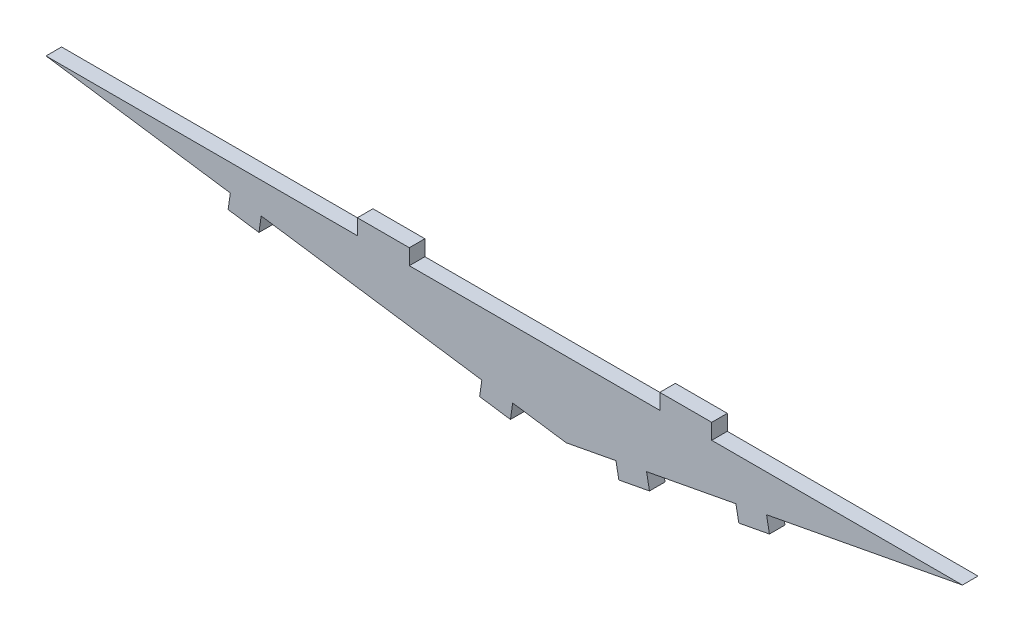
ISO-10303-21;
HEADER;
FILE_DESCRIPTION(('STEP AP214'),'2;1');
FILE_NAME('part.step','',(''),(''),'','','');
FILE_SCHEMA(('AUTOMOTIVE_DESIGN { 1 0 10303 214 1 1 1 1 }'));
ENDSEC;
DATA;
#1=APPLICATION_CONTEXT('core data for automotive mechanical design processes');
#2=APPLICATION_PROTOCOL_DEFINITION('international standard','automotive_design',2000,#1);
#3=PRODUCT_CONTEXT('',#1,'mechanical');
#4=PRODUCT('Part','Part','',(#3));
#5=PRODUCT_RELATED_PRODUCT_CATEGORY('part','',(#4));
#6=PRODUCT_DEFINITION_FORMATION('','',#4);
#7=PRODUCT_DEFINITION_CONTEXT('part definition',#1,'design');
#8=PRODUCT_DEFINITION('design','',#6,#7);
#9=PRODUCT_DEFINITION_SHAPE('','',#8);
#10=(LENGTH_UNIT() NAMED_UNIT(*) SI_UNIT(.MILLI.,.METRE.));
#11=(NAMED_UNIT(*) PLANE_ANGLE_UNIT() SI_UNIT($,.RADIAN.));
#12=(NAMED_UNIT(*) SI_UNIT($,.STERADIAN.) SOLID_ANGLE_UNIT());
#13=UNCERTAINTY_MEASURE_WITH_UNIT(LENGTH_MEASURE(1.E-05),#10,'distance_accuracy_value','');
#14=(GEOMETRIC_REPRESENTATION_CONTEXT(3) GLOBAL_UNCERTAINTY_ASSIGNED_CONTEXT((#13)) GLOBAL_UNIT_ASSIGNED_CONTEXT((#10,
#11,#12)) REPRESENTATION_CONTEXT('',''));
#15=CARTESIAN_POINT('',(0.,0.,0.));
#16=DIRECTION('',(0.,0.,1.));
#17=DIRECTION('',(1.,0.,0.));
#18=AXIS2_PLACEMENT_3D('',#15,#16,#17);
#19=CARTESIAN_POINT('',(-43.4902370561024,-7.93091694263517,-1.524));
#20=DIRECTION('',(0.185772423247235,-0.982592798040394,0.));
#21=DIRECTION('',(0.982592798040394,0.185772423247235,0.));
#22=AXIS2_PLACEMENT_3D('',#19,#20,#21);
#23=PLANE('',#22);
#24=DIRECTION('',(0.982592798040394,0.185772423247235,0.));
#25=VECTOR('',#24,1.);
#26=CARTESIAN_POINT('',(-43.4902370561024,-7.93091694263517,0.));
#27=LINE('',#26,#25);
#28=CARTESIAN_POINT('',(-48.3559852926874,-8.85085228372873,0.));
#29=VERTEX_POINT('',#28);
#30=CARTESIAN_POINT('',(-43.4902370561024,-7.93091694263517,0.));
#31=VERTEX_POINT('',#30);
#32=EDGE_CURVE('E247',#29,#31,#27,.T.);
#33=ORIENTED_EDGE('',*,*,#32,.F.);
#34=DIRECTION('',(0.,0.,1.));
#35=VECTOR('',#34,1.);
#36=CARTESIAN_POINT('',(-48.3559852926874,-8.85085228372873,-1.524));
#37=LINE('',#36,#35);
#38=CARTESIAN_POINT('',(-48.3559852926874,-8.85085228372873,-1.524));
#39=VERTEX_POINT('',#38);
#40=EDGE_CURVE('E11',#39,#29,#37,.T.);
#41=ORIENTED_EDGE('',*,*,#40,.F.);
#42=DIRECTION('',(0.982592798040394,0.185772423247235,0.));
#43=VECTOR('',#42,1.);
#44=CARTESIAN_POINT('',(-43.4902370561024,-7.93091694263517,-1.524));
#45=LINE('',#44,#43);
#46=CARTESIAN_POINT('',(-43.4902370561024,-7.93091694263517,-1.524));
#47=VERTEX_POINT('',#46);
#48=EDGE_CURVE('E324',#39,#47,#45,.T.);
#49=ORIENTED_EDGE('',*,*,#48,.T.);
#50=DIRECTION('',(0.,0.,1.));
#51=VECTOR('',#50,1.);
#52=CARTESIAN_POINT('',(-43.4902370561024,-7.93091694263517,-1.524));
#53=LINE('',#52,#51);
#54=EDGE_CURVE('E39',#47,#31,#53,.T.);
#55=ORIENTED_EDGE('',*,*,#54,.T.);
#56=EDGE_LOOP('',(#33,#41,#49,#55));
#57=FACE_BOUND('',#56,.T.);
#58=ADVANCED_FACE('F36',(#57),#23,.T.);
#59=CARTESIAN_POINT('',(-48.3559852926874,-8.85085228372873,-1.524));
#60=DIRECTION('',(-0.142523711830452,-0.989791387902557,0.));
#61=DIRECTION('',(0.989791387902557,-0.142523711830452,0.));
#62=AXIS2_PLACEMENT_3D('',#59,#60,#61);
#63=PLANE('',#62);
#64=DIRECTION('',(0.989791387902557,-0.142523711830452,0.));
#65=VECTOR('',#64,1.);
#66=CARTESIAN_POINT('',(-48.3559852926874,-8.85085228372873,0.));
#67=LINE('',#66,#65);
#68=CARTESIAN_POINT('',(-53.5933554469959,-8.09670404224538,0.));
#69=VERTEX_POINT('',#68);
#70=EDGE_CURVE('E322',#69,#29,#67,.T.);
#71=ORIENTED_EDGE('',*,*,#70,.F.);
#72=DIRECTION('',(0.,0.,1.));
#73=VECTOR('',#72,1.);
#74=CARTESIAN_POINT('',(-53.5933554469959,-8.09670404224538,-1.524));
#75=LINE('',#74,#73);
#76=CARTESIAN_POINT('',(-53.5933554469959,-8.09670404224538,-1.524));
#77=VERTEX_POINT('',#76);
#78=EDGE_CURVE('E45',#77,#69,#75,.T.);
#79=ORIENTED_EDGE('',*,*,#78,.F.);
#80=DIRECTION('',(0.989791387902557,-0.142523711830452,0.));
#81=VECTOR('',#80,1.);
#82=CARTESIAN_POINT('',(-48.3559852926874,-8.85085228372873,-1.524));
#83=LINE('',#82,#81);
#84=EDGE_CURVE('E237',#77,#39,#83,.T.);
#85=ORIENTED_EDGE('',*,*,#84,.T.);
#86=ORIENTED_EDGE('',*,*,#40,.T.);
#87=EDGE_LOOP('',(#71,#79,#85,#86));
#88=FACE_BOUND('',#87,.T.);
#89=ADVANCED_FACE('F374',(#88),#63,.T.);
#90=CARTESIAN_POINT('',(-53.5933554469959,-8.09670404224538,-1.524));
#91=DIRECTION('',(0.989791387902557,-0.142523711830451,0.));
#92=DIRECTION('',(0.142523711830451,0.989791387902557,0.));
#93=AXIS2_PLACEMENT_3D('',#90,#91,#92);
#94=PLANE('',#93);
#95=DIRECTION('',(0.142523711830451,0.989791387902557,0.));
#96=VECTOR('',#95,1.);
#97=CARTESIAN_POINT('',(-53.5933554469959,-8.09670404224538,0.));
#98=LINE('',#97,#96);
#99=CARTESIAN_POINT('',(-53.8105615838256,-9.60514611740887,0.));
#100=VERTEX_POINT('',#99);
#101=EDGE_CURVE('E224',#100,#69,#98,.T.);
#102=ORIENTED_EDGE('',*,*,#101,.F.);
#103=DIRECTION('',(0.,0.,1.));
#104=VECTOR('',#103,1.);
#105=CARTESIAN_POINT('',(-53.8105615838256,-9.60514611740887,-1.524));
#106=LINE('',#105,#104);
#107=CARTESIAN_POINT('',(-53.8105615838256,-9.60514611740887,-1.524));
#108=VERTEX_POINT('',#107);
#109=EDGE_CURVE('E219',#108,#100,#106,.T.);
#110=ORIENTED_EDGE('',*,*,#109,.F.);
#111=DIRECTION('',(0.142523711830451,0.989791387902557,0.));
#112=VECTOR('',#111,1.);
#113=CARTESIAN_POINT('',(-53.5933554469959,-8.09670404224538,-1.524));
#114=LINE('',#113,#112);
#115=EDGE_CURVE('E222',#108,#77,#114,.T.);
#116=ORIENTED_EDGE('',*,*,#115,.T.);
#117=ORIENTED_EDGE('',*,*,#78,.T.);
#118=EDGE_LOOP('',(#102,#110,#116,#117));
#119=FACE_BOUND('',#118,.T.);
#120=ADVANCED_FACE('F221',(#119),#94,.T.);
#121=CARTESIAN_POINT('',(-56.8274457341525,-9.17073384374966,-1.524));
#122=DIRECTION('',(-0.142523711830451,-0.989791387902557,0.));
#123=DIRECTION('',(0.989791387902557,-0.142523711830451,0.));
#124=AXIS2_PLACEMENT_3D('',#121,#122,#123);
#125=PLANE('',#124);
#126=DIRECTION('',(0.989791387902557,-0.142523711830451,0.));
#127=VECTOR('',#126,1.);
#128=CARTESIAN_POINT('',(-56.8274457341525,-9.17073384374966,0.));
#129=LINE('',#128,#127);
#130=CARTESIAN_POINT('',(-56.8274457341525,-9.17073384374966,0.));
#131=VERTEX_POINT('',#130);
#132=EDGE_CURVE('E319',#131,#100,#129,.T.);
#133=ORIENTED_EDGE('',*,*,#132,.F.);
#134=DIRECTION('',(0.,0.,1.));
#135=VECTOR('',#134,1.);
#136=CARTESIAN_POINT('',(-56.8274457341525,-9.17073384374966,-1.524));
#137=LINE('',#136,#135);
#138=CARTESIAN_POINT('',(-56.8274457341525,-9.17073384374966,-1.524));
#139=VERTEX_POINT('',#138);
#140=EDGE_CURVE('E229',#139,#131,#137,.T.);
#141=ORIENTED_EDGE('',*,*,#140,.F.);
#142=DIRECTION('',(0.989791387902557,-0.142523711830451,0.));
#143=VECTOR('',#142,1.);
#144=CARTESIAN_POINT('',(-56.8274457341525,-9.17073384374966,-1.524));
#145=LINE('',#144,#143);
#146=EDGE_CURVE('E235',#139,#108,#145,.T.);
#147=ORIENTED_EDGE('',*,*,#146,.T.);
#148=ORIENTED_EDGE('',*,*,#109,.T.);
#149=EDGE_LOOP('',(#133,#141,#147,#148));
#150=FACE_BOUND('',#149,.T.);
#151=ADVANCED_FACE('F239',(#150),#125,.T.);
#152=CARTESIAN_POINT('',(-56.6102395973229,-7.66229176858616,-1.524));
#153=DIRECTION('',(-0.989791387902557,0.142523711830451,0.));
#154=DIRECTION('',(-0.142523711830451,-0.989791387902557,0.));
#155=AXIS2_PLACEMENT_3D('',#152,#153,#154);
#156=PLANE('',#155);
#157=DIRECTION('',(-0.142523711830451,-0.989791387902557,0.));
#158=VECTOR('',#157,1.);
#159=CARTESIAN_POINT('',(-56.6102395973229,-7.66229176858616,0.));
#160=LINE('',#159,#158);
#161=CARTESIAN_POINT('',(-56.6102395973229,-7.66229176858616,0.));
#162=VERTEX_POINT('',#161);
#163=EDGE_CURVE('E316',#162,#131,#160,.T.);
#164=ORIENTED_EDGE('',*,*,#163,.F.);
#165=DIRECTION('',(0.,0.,1.));
#166=VECTOR('',#165,1.);
#167=CARTESIAN_POINT('',(-56.6102395973229,-7.66229176858616,-1.524));
#168=LINE('',#167,#166);
#169=CARTESIAN_POINT('',(-56.6102395973229,-7.66229176858616,-1.524));
#170=VERTEX_POINT('',#169);
#171=EDGE_CURVE('E328',#170,#162,#168,.T.);
#172=ORIENTED_EDGE('',*,*,#171,.F.);
#173=DIRECTION('',(-0.142523711830451,-0.989791387902557,0.));
#174=VECTOR('',#173,1.);
#175=CARTESIAN_POINT('',(-56.6102395973229,-7.66229176858616,-1.524));
#176=LINE('',#175,#174);
#177=EDGE_CURVE('E240',#170,#139,#176,.T.);
#178=ORIENTED_EDGE('',*,*,#177,.T.);
#179=ORIENTED_EDGE('',*,*,#140,.T.);
#180=EDGE_LOOP('',(#164,#172,#178,#179));
#181=FACE_BOUND('',#180,.T.);
#182=ADVANCED_FACE('F387',(#181),#156,.T.);
#183=CARTESIAN_POINT('',(-56.6102395973229,-7.66229176858616,-1.524));
#184=DIRECTION('',(-0.142523711830451,-0.989791387902557,0.));
#185=DIRECTION('',(0.989791387902557,-0.142523711830451,0.));
#186=AXIS2_PLACEMENT_3D('',#183,#184,#185);
#187=PLANE('',#186);
#188=DIRECTION('',(0.989791387902557,-0.142523711830451,0.));
#189=VECTOR('',#188,1.);
#190=CARTESIAN_POINT('',(-56.6102395973229,-7.66229176858616,0.));
#191=LINE('',#190,#189);
#192=CARTESIAN_POINT('',(-78.1919267212805,-4.55466505646862,0.));
#193=VERTEX_POINT('',#192);
#194=EDGE_CURVE('E313',#193,#162,#191,.T.);
#195=ORIENTED_EDGE('',*,*,#194,.F.);
#196=DIRECTION('',(0.,0.,1.));
#197=VECTOR('',#196,1.);
#198=CARTESIAN_POINT('',(-78.1919267212805,-4.55466505646862,-1.524));
#199=LINE('',#198,#197);
#200=CARTESIAN_POINT('',(-78.1919267212805,-4.55466505646862,-1.524));
#201=VERTEX_POINT('',#200);
#202=EDGE_CURVE('E330',#201,#193,#199,.T.);
#203=ORIENTED_EDGE('',*,*,#202,.F.);
#204=DIRECTION('',(0.989791387902557,-0.142523711830451,0.));
#205=VECTOR('',#204,1.);
#206=CARTESIAN_POINT('',(-56.6102395973229,-7.66229176858616,-1.524));
#207=LINE('',#206,#205);
#208=EDGE_CURVE('E242',#201,#170,#207,.T.);
#209=ORIENTED_EDGE('',*,*,#208,.T.);
#210=ORIENTED_EDGE('',*,*,#171,.T.);
#211=EDGE_LOOP('',(#195,#203,#209,#210));
#212=FACE_BOUND('',#211,.T.);
#213=ADVANCED_FACE('F390',(#212),#187,.T.);
#214=CARTESIAN_POINT('',(-78.1919267212805,-4.55466505646862,-1.524));
#215=DIRECTION('',(0.989791387902558,-0.142523711830447,0.));
#216=DIRECTION('',(0.142523711830447,0.989791387902558,0.));
#217=AXIS2_PLACEMENT_3D('',#214,#215,#216);
#218=PLANE('',#217);
#219=DIRECTION('',(0.142523711830447,0.989791387902558,0.));
#220=VECTOR('',#219,1.);
#221=CARTESIAN_POINT('',(-78.1919267212805,-4.55466505646862,0.));
#222=LINE('',#221,#220);
#223=CARTESIAN_POINT('',(-78.4091328581101,-6.06310713163212,0.));
#224=VERTEX_POINT('',#223);
#225=EDGE_CURVE('E310',#224,#193,#222,.T.);
#226=ORIENTED_EDGE('',*,*,#225,.F.);
#227=DIRECTION('',(0.,0.,1.));
#228=VECTOR('',#227,1.);
#229=CARTESIAN_POINT('',(-78.4091328581101,-6.06310713163212,-1.524));
#230=LINE('',#229,#228);
#231=CARTESIAN_POINT('',(-78.4091328581101,-6.06310713163212,-1.524));
#232=VERTEX_POINT('',#231);
#233=EDGE_CURVE('E332',#232,#224,#230,.T.);
#234=ORIENTED_EDGE('',*,*,#233,.F.);
#235=DIRECTION('',(0.142523711830447,0.989791387902558,0.));
#236=VECTOR('',#235,1.);
#237=CARTESIAN_POINT('',(-78.1919267212805,-4.55466505646862,-1.524));
#238=LINE('',#237,#236);
#239=EDGE_CURVE('E721',#232,#201,#238,.T.);
#240=ORIENTED_EDGE('',*,*,#239,.T.);
#241=ORIENTED_EDGE('',*,*,#202,.T.);
#242=EDGE_LOOP('',(#226,#234,#240,#241));
#243=FACE_BOUND('',#242,.T.);
#244=ADVANCED_FACE('F394',(#243),#218,.T.);
#245=CARTESIAN_POINT('',(-81.4260170084371,-5.6286948579729,-1.524));
#246=DIRECTION('',(-0.142523711830451,-0.989791387902557,0.));
#247=DIRECTION('',(0.989791387902557,-0.142523711830451,0.));
#248=AXIS2_PLACEMENT_3D('',#245,#246,#247);
#249=PLANE('',#248);
#250=DIRECTION('',(0.989791387902557,-0.142523711830451,0.));
#251=VECTOR('',#250,1.);
#252=CARTESIAN_POINT('',(-81.4260170084371,-5.6286948579729,0.));
#253=LINE('',#252,#251);
#254=CARTESIAN_POINT('',(-81.4260170084371,-5.6286948579729,0.));
#255=VERTEX_POINT('',#254);
#256=EDGE_CURVE('E307',#255,#224,#253,.T.);
#257=ORIENTED_EDGE('',*,*,#256,.F.);
#258=DIRECTION('',(0.,0.,1.));
#259=VECTOR('',#258,1.);
#260=CARTESIAN_POINT('',(-81.4260170084371,-5.6286948579729,-1.524));
#261=LINE('',#260,#259);
#262=CARTESIAN_POINT('',(-81.4260170084371,-5.6286948579729,-1.524));
#263=VERTEX_POINT('',#262);
#264=EDGE_CURVE('E334',#263,#255,#261,.T.);
#265=ORIENTED_EDGE('',*,*,#264,.F.);
#266=DIRECTION('',(0.989791387902557,-0.142523711830451,0.));
#267=VECTOR('',#266,1.);
#268=CARTESIAN_POINT('',(-81.4260170084371,-5.6286948579729,-1.524));
#269=LINE('',#268,#267);
#270=EDGE_CURVE('E725',#263,#232,#269,.T.);
#271=ORIENTED_EDGE('',*,*,#270,.T.);
#272=ORIENTED_EDGE('',*,*,#233,.T.);
#273=EDGE_LOOP('',(#257,#265,#271,#272));
#274=FACE_BOUND('',#273,.T.);
#275=ADVANCED_FACE('F398',(#274),#249,.T.);
#276=CARTESIAN_POINT('',(-81.2088108716075,-4.1202527828094,-1.524));
#277=DIRECTION('',(-0.989791387902558,0.142523711830447,0.));
#278=DIRECTION('',(-0.142523711830447,-0.989791387902558,0.));
#279=AXIS2_PLACEMENT_3D('',#276,#277,#278);
#280=PLANE('',#279);
#281=DIRECTION('',(-0.142523711830447,-0.989791387902558,0.));
#282=VECTOR('',#281,1.);
#283=CARTESIAN_POINT('',(-81.2088108716075,-4.1202527828094,0.));
#284=LINE('',#283,#282);
#285=CARTESIAN_POINT('',(-81.2088108716075,-4.1202527828094,0.));
#286=VERTEX_POINT('',#285);
#287=EDGE_CURVE('E304',#286,#255,#284,.T.);
#288=ORIENTED_EDGE('',*,*,#287,.F.);
#289=DIRECTION('',(0.,0.,1.));
#290=VECTOR('',#289,1.);
#291=CARTESIAN_POINT('',(-81.2088108716075,-4.1202527828094,-1.524));
#292=LINE('',#291,#290);
#293=CARTESIAN_POINT('',(-81.2088108716075,-4.1202527828094,-1.524));
#294=VERTEX_POINT('',#293);
#295=EDGE_CURVE('E336',#294,#286,#292,.T.);
#296=ORIENTED_EDGE('',*,*,#295,.F.);
#297=DIRECTION('',(-0.142523711830447,-0.989791387902558,0.));
#298=VECTOR('',#297,1.);
#299=CARTESIAN_POINT('',(-81.2088108716075,-4.1202527828094,-1.524));
#300=LINE('',#299,#298);
#301=EDGE_CURVE('E714',#294,#263,#300,.T.);
#302=ORIENTED_EDGE('',*,*,#301,.T.);
#303=ORIENTED_EDGE('',*,*,#264,.T.);
#304=EDGE_LOOP('',(#288,#296,#302,#303));
#305=FACE_BOUND('',#304,.T.);
#306=ADVANCED_FACE('F402',(#305),#280,.T.);
#307=CARTESIAN_POINT('',(-81.2088108716075,-4.1202527828094,-1.524));
#308=DIRECTION('',(-0.142523711830451,-0.989791387902557,0.));
#309=DIRECTION('',(0.989791387902557,-0.142523711830451,0.));
#310=AXIS2_PLACEMENT_3D('',#307,#308,#309);
#311=PLANE('',#310);
#312=DIRECTION('',(0.989791387902557,-0.142523711830451,0.));
#313=VECTOR('',#312,1.);
#314=CARTESIAN_POINT('',(-81.2088108716075,-4.1202527828094,0.));
#315=LINE('',#314,#313);
#316=CARTESIAN_POINT('',(-99.2391344734781,-1.524,0.));
#317=VERTEX_POINT('',#316);
#318=EDGE_CURVE('E301',#317,#286,#315,.T.);
#319=ORIENTED_EDGE('',*,*,#318,.F.);
#320=DIRECTION('',(0.,0.,1.));
#321=VECTOR('',#320,1.);
#322=CARTESIAN_POINT('',(-99.2391344734781,-1.524,-1.524));
#323=LINE('',#322,#321);
#324=CARTESIAN_POINT('',(-99.2391344734781,-1.524,-1.524));
#325=VERTEX_POINT('',#324);
#326=EDGE_CURVE('E338',#325,#317,#323,.T.);
#327=ORIENTED_EDGE('',*,*,#326,.F.);
#328=DIRECTION('',(0.989791387902557,-0.142523711830451,0.));
#329=VECTOR('',#328,1.);
#330=CARTESIAN_POINT('',(-81.2088108716075,-4.1202527828094,-1.524));
#331=LINE('',#330,#329);
#332=EDGE_CURVE('E710',#325,#294,#331,.T.);
#333=ORIENTED_EDGE('',*,*,#332,.T.);
#334=ORIENTED_EDGE('',*,*,#295,.T.);
#335=EDGE_LOOP('',(#319,#327,#333,#334));
#336=FACE_BOUND('',#335,.T.);
#337=ADVANCED_FACE('F406',(#336),#311,.T.);
#338=CARTESIAN_POINT('',(-68.7830945293226,-1.524,-1.524));
#339=DIRECTION('',(0.,1.,0.));
#340=DIRECTION('',(0.,0.,1.));
#341=AXIS2_PLACEMENT_3D('',#338,#339,#340);
#342=PLANE('',#341);
#343=DIRECTION('',(-1.,0.,0.));
#344=VECTOR('',#343,1.);
#345=CARTESIAN_POINT('',(-68.7830945293226,-1.524,0.));
#346=LINE('',#345,#344);
#347=CARTESIAN_POINT('',(-68.7830945293226,-1.524,0.));
#348=VERTEX_POINT('',#347);
#349=EDGE_CURVE('E298',#348,#317,#346,.T.);
#350=ORIENTED_EDGE('',*,*,#349,.F.);
#351=DIRECTION('',(0.,0.,1.));
#352=VECTOR('',#351,1.);
#353=CARTESIAN_POINT('',(-68.7830945293226,-1.524,-1.524));
#354=LINE('',#353,#352);
#355=CARTESIAN_POINT('',(-68.7830945293226,-1.524,-1.524));
#356=VERTEX_POINT('',#355);
#357=EDGE_CURVE('E340',#356,#348,#354,.T.);
#358=ORIENTED_EDGE('',*,*,#357,.F.);
#359=DIRECTION('',(-1.,0.,0.));
#360=VECTOR('',#359,1.);
#361=CARTESIAN_POINT('',(-68.7830945293226,-1.524,-1.524));
#362=LINE('',#361,#360);
#363=EDGE_CURVE('E731',#356,#325,#362,.T.);
#364=ORIENTED_EDGE('',*,*,#363,.T.);
#365=ORIENTED_EDGE('',*,*,#326,.T.);
#366=EDGE_LOOP('',(#350,#358,#364,#365));
#367=FACE_BOUND('',#366,.T.);
#368=ADVANCED_FACE('F410',(#367),#342,.T.);
#369=CARTESIAN_POINT('',(-68.7830945293226,-1.524,-1.524));
#370=DIRECTION('',(-1.,0.,0.));
#371=DIRECTION('',(0.,0.,1.));
#372=AXIS2_PLACEMENT_3D('',#369,#370,#371);
#373=PLANE('',#372);
#374=DIRECTION('',(0.,-1.,0.));
#375=VECTOR('',#374,1.);
#376=CARTESIAN_POINT('',(-68.7830945293226,-1.524,0.));
#377=LINE('',#376,#375);
#378=CARTESIAN_POINT('',(-68.7830945293226,0.,0.));
#379=VERTEX_POINT('',#378);
#380=EDGE_CURVE('E295',#379,#348,#377,.T.);
#381=ORIENTED_EDGE('',*,*,#380,.F.);
#382=DIRECTION('',(0.,0.,1.));
#383=VECTOR('',#382,1.);
#384=CARTESIAN_POINT('',(-68.7830945293226,0.,-1.524));
#385=LINE('',#384,#383);
#386=CARTESIAN_POINT('',(-68.7830945293226,0.,-1.524));
#387=VERTEX_POINT('',#386);
#388=EDGE_CURVE('E342',#387,#379,#385,.T.);
#389=ORIENTED_EDGE('',*,*,#388,.F.);
#390=DIRECTION('',(0.,-1.,0.));
#391=VECTOR('',#390,1.);
#392=CARTESIAN_POINT('',(-68.7830945293226,-1.524,-1.524));
#393=LINE('',#392,#391);
#394=EDGE_CURVE('E703',#387,#356,#393,.T.);
#395=ORIENTED_EDGE('',*,*,#394,.T.);
#396=ORIENTED_EDGE('',*,*,#357,.T.);
#397=EDGE_LOOP('',(#381,#389,#395,#396));
#398=FACE_BOUND('',#397,.T.);
#399=ADVANCED_FACE('F414',(#398),#373,.T.);
#400=CARTESIAN_POINT('',(-63.7030945293226,0.,-1.524));
#401=DIRECTION('',(0.,1.,0.));
#402=DIRECTION('',(0.,0.,1.));
#403=AXIS2_PLACEMENT_3D('',#400,#401,#402);
#404=PLANE('',#403);
#405=DIRECTION('',(-1.,0.,0.));
#406=VECTOR('',#405,1.);
#407=CARTESIAN_POINT('',(-63.7030945293226,0.,0.));
#408=LINE('',#407,#406);
#409=CARTESIAN_POINT('',(-63.7030945293226,0.,0.));
#410=VERTEX_POINT('',#409);
#411=EDGE_CURVE('E292',#410,#379,#408,.T.);
#412=ORIENTED_EDGE('',*,*,#411,.F.);
#413=DIRECTION('',(0.,0.,1.));
#414=VECTOR('',#413,1.);
#415=CARTESIAN_POINT('',(-63.7030945293226,0.,-1.524));
#416=LINE('',#415,#414);
#417=CARTESIAN_POINT('',(-63.7030945293226,0.,-1.524));
#418=VERTEX_POINT('',#417);
#419=EDGE_CURVE('E344',#418,#410,#416,.T.);
#420=ORIENTED_EDGE('',*,*,#419,.F.);
#421=DIRECTION('',(-1.,0.,0.));
#422=VECTOR('',#421,1.);
#423=CARTESIAN_POINT('',(-63.7030945293226,0.,-1.524));
#424=LINE('',#423,#422);
#425=EDGE_CURVE('E699',#418,#387,#424,.T.);
#426=ORIENTED_EDGE('',*,*,#425,.T.);
#427=ORIENTED_EDGE('',*,*,#388,.T.);
#428=EDGE_LOOP('',(#412,#420,#426,#427));
#429=FACE_BOUND('',#428,.T.);
#430=ADVANCED_FACE('F418',(#429),#404,.T.);
#431=CARTESIAN_POINT('',(-63.7030945293226,-1.524,-1.524));
#432=DIRECTION('',(1.,0.,0.));
#433=DIRECTION('',(0.,0.,-1.));
#434=AXIS2_PLACEMENT_3D('',#431,#432,#433);
#435=PLANE('',#434);
#436=DIRECTION('',(0.,1.,0.));
#437=VECTOR('',#436,1.);
#438=CARTESIAN_POINT('',(-63.7030945293226,-1.524,0.));
#439=LINE('',#438,#437);
#440=CARTESIAN_POINT('',(-63.7030945293226,-1.524,0.));
#441=VERTEX_POINT('',#440);
#442=EDGE_CURVE('E289',#441,#410,#439,.T.);
#443=ORIENTED_EDGE('',*,*,#442,.F.);
#444=DIRECTION('',(0.,0.,1.));
#445=VECTOR('',#444,1.);
#446=CARTESIAN_POINT('',(-63.7030945293226,-1.524,-1.524));
#447=LINE('',#446,#445);
#448=CARTESIAN_POINT('',(-63.7030945293226,-1.524,-1.524));
#449=VERTEX_POINT('',#448);
#450=EDGE_CURVE('E346',#449,#441,#447,.T.);
#451=ORIENTED_EDGE('',*,*,#450,.F.);
#452=DIRECTION('',(0.,1.,0.));
#453=VECTOR('',#452,1.);
#454=CARTESIAN_POINT('',(-63.7030945293226,-1.524,-1.524));
#455=LINE('',#454,#453);
#456=EDGE_CURVE('E735',#449,#418,#455,.T.);
#457=ORIENTED_EDGE('',*,*,#456,.T.);
#458=ORIENTED_EDGE('',*,*,#419,.T.);
#459=EDGE_LOOP('',(#443,#451,#457,#458));
#460=FACE_BOUND('',#459,.T.);
#461=ADVANCED_FACE('F422',(#460),#435,.T.);
#462=CARTESIAN_POINT('',(-39.202780193833,-1.524,-1.524));
#463=DIRECTION('',(0.,1.,0.));
#464=DIRECTION('',(-1.,0.,0.));
#465=AXIS2_PLACEMENT_3D('',#462,#463,#464);
#466=PLANE('',#465);
#467=DIRECTION('',(-1.,0.,0.));
#468=VECTOR('',#467,1.);
#469=CARTESIAN_POINT('',(-39.202780193833,-1.524,0.));
#470=LINE('',#469,#468);
#471=CARTESIAN_POINT('',(-39.202780193833,-1.524,0.));
#472=VERTEX_POINT('',#471);
#473=EDGE_CURVE('E286',#472,#441,#470,.T.);
#474=ORIENTED_EDGE('',*,*,#473,.F.);
#475=DIRECTION('',(0.,0.,1.));
#476=VECTOR('',#475,1.);
#477=CARTESIAN_POINT('',(-39.202780193833,-1.524,-1.524));
#478=LINE('',#477,#476);
#479=CARTESIAN_POINT('',(-39.202780193833,-1.524,-1.524));
#480=VERTEX_POINT('',#479);
#481=EDGE_CURVE('E348',#480,#472,#478,.T.);
#482=ORIENTED_EDGE('',*,*,#481,.F.);
#483=DIRECTION('',(-1.,0.,0.));
#484=VECTOR('',#483,1.);
#485=CARTESIAN_POINT('',(-39.202780193833,-1.524,-1.524));
#486=LINE('',#485,#484);
#487=EDGE_CURVE('E692',#480,#449,#486,.T.);
#488=ORIENTED_EDGE('',*,*,#487,.T.);
#489=ORIENTED_EDGE('',*,*,#450,.T.);
#490=EDGE_LOOP('',(#474,#482,#488,#489));
#491=FACE_BOUND('',#490,.T.);
#492=ADVANCED_FACE('F426',(#491),#466,.T.);
#493=CARTESIAN_POINT('',(-39.202780193833,-1.524,-1.524));
#494=DIRECTION('',(-1.,0.,0.));
#495=DIRECTION('',(0.,0.,1.));
#496=AXIS2_PLACEMENT_3D('',#493,#494,#495);
#497=PLANE('',#496);
#498=DIRECTION('',(0.,-1.,0.));
#499=VECTOR('',#498,1.);
#500=CARTESIAN_POINT('',(-39.202780193833,-1.524,0.));
#501=LINE('',#500,#499);
#502=CARTESIAN_POINT('',(-39.202780193833,0.,0.));
#503=VERTEX_POINT('',#502);
#504=EDGE_CURVE('E283',#503,#472,#501,.T.);
#505=ORIENTED_EDGE('',*,*,#504,.F.);
#506=DIRECTION('',(0.,0.,1.));
#507=VECTOR('',#506,1.);
#508=CARTESIAN_POINT('',(-39.202780193833,0.,-1.524));
#509=LINE('',#508,#507);
#510=CARTESIAN_POINT('',(-39.202780193833,0.,-1.524));
#511=VERTEX_POINT('',#510);
#512=EDGE_CURVE('E350',#511,#503,#509,.T.);
#513=ORIENTED_EDGE('',*,*,#512,.F.);
#514=DIRECTION('',(0.,-1.,0.));
#515=VECTOR('',#514,1.);
#516=CARTESIAN_POINT('',(-39.202780193833,-1.524,-1.524));
#517=LINE('',#516,#515);
#518=EDGE_CURVE('E688',#511,#480,#517,.T.);
#519=ORIENTED_EDGE('',*,*,#518,.T.);
#520=ORIENTED_EDGE('',*,*,#481,.T.);
#521=EDGE_LOOP('',(#505,#513,#519,#520));
#522=FACE_BOUND('',#521,.T.);
#523=ADVANCED_FACE('F430',(#522),#497,.T.);
#524=CARTESIAN_POINT('',(-34.1227801938331,0.,-1.524));
#525=DIRECTION('',(0.,1.,0.));
#526=DIRECTION('',(0.,0.,1.));
#527=AXIS2_PLACEMENT_3D('',#524,#525,#526);
#528=PLANE('',#527);
#529=DIRECTION('',(-1.,0.,0.));
#530=VECTOR('',#529,1.);
#531=CARTESIAN_POINT('',(-34.1227801938331,0.,0.));
#532=LINE('',#531,#530);
#533=CARTESIAN_POINT('',(-34.1227801938331,0.,0.));
#534=VERTEX_POINT('',#533);
#535=EDGE_CURVE('E280',#534,#503,#532,.T.);
#536=ORIENTED_EDGE('',*,*,#535,.F.);
#537=DIRECTION('',(0.,0.,1.));
#538=VECTOR('',#537,1.);
#539=CARTESIAN_POINT('',(-34.1227801938331,0.,-1.524));
#540=LINE('',#539,#538);
#541=CARTESIAN_POINT('',(-34.1227801938331,0.,-1.524));
#542=VERTEX_POINT('',#541);
#543=EDGE_CURVE('E352',#542,#534,#540,.T.);
#544=ORIENTED_EDGE('',*,*,#543,.F.);
#545=DIRECTION('',(-1.,0.,0.));
#546=VECTOR('',#545,1.);
#547=CARTESIAN_POINT('',(-34.1227801938331,0.,-1.524));
#548=LINE('',#547,#546);
#549=EDGE_CURVE('E739',#542,#511,#548,.T.);
#550=ORIENTED_EDGE('',*,*,#549,.T.);
#551=ORIENTED_EDGE('',*,*,#512,.T.);
#552=EDGE_LOOP('',(#536,#544,#550,#551));
#553=FACE_BOUND('',#552,.T.);
#554=ADVANCED_FACE('F434',(#553),#528,.T.);
#555=CARTESIAN_POINT('',(-34.1227801938331,-1.524,-1.524));
#556=DIRECTION('',(1.,0.,0.));
#557=DIRECTION('',(0.,0.,-1.));
#558=AXIS2_PLACEMENT_3D('',#555,#556,#557);
#559=PLANE('',#558);
#560=DIRECTION('',(0.,1.,0.));
#561=VECTOR('',#560,1.);
#562=CARTESIAN_POINT('',(-34.1227801938331,-1.524,0.));
#563=LINE('',#562,#561);
#564=CARTESIAN_POINT('',(-34.1227801938331,-1.524,0.));
#565=VERTEX_POINT('',#564);
#566=EDGE_CURVE('E277',#565,#534,#563,.T.);
#567=ORIENTED_EDGE('',*,*,#566,.F.);
#568=DIRECTION('',(0.,0.,1.));
#569=VECTOR('',#568,1.);
#570=CARTESIAN_POINT('',(-34.1227801938331,-1.524,-1.524));
#571=LINE('',#570,#569);
#572=CARTESIAN_POINT('',(-34.1227801938331,-1.524,-1.524));
#573=VERTEX_POINT('',#572);
#574=EDGE_CURVE('E354',#573,#565,#571,.T.);
#575=ORIENTED_EDGE('',*,*,#574,.F.);
#576=DIRECTION('',(0.,1.,0.));
#577=VECTOR('',#576,1.);
#578=CARTESIAN_POINT('',(-34.1227801938331,-1.524,-1.524));
#579=LINE('',#578,#577);
#580=EDGE_CURVE('E681',#573,#542,#579,.T.);
#581=ORIENTED_EDGE('',*,*,#580,.T.);
#582=ORIENTED_EDGE('',*,*,#543,.T.);
#583=EDGE_LOOP('',(#567,#575,#581,#582));
#584=FACE_BOUND('',#583,.T.);
#585=ADVANCED_FACE('F438',(#584),#559,.T.);
#586=CARTESIAN_POINT('',(-9.60258928021059,-1.524,-1.524));
#587=DIRECTION('',(0.,1.,0.));
#588=DIRECTION('',(0.,0.,1.));
#589=AXIS2_PLACEMENT_3D('',#586,#587,#588);
#590=PLANE('',#589);
#591=DIRECTION('',(-1.,0.,0.));
#592=VECTOR('',#591,1.);
#593=CARTESIAN_POINT('',(-9.60258928021059,-1.524,0.));
#594=LINE('',#593,#592);
#595=CARTESIAN_POINT('',(-9.60258928021059,-1.524,0.));
#596=VERTEX_POINT('',#595);
#597=EDGE_CURVE('E274',#596,#565,#594,.T.);
#598=ORIENTED_EDGE('',*,*,#597,.F.);
#599=DIRECTION('',(0.,0.,1.));
#600=VECTOR('',#599,1.);
#601=CARTESIAN_POINT('',(-9.60258928021059,-1.524,-1.524));
#602=LINE('',#601,#600);
#603=CARTESIAN_POINT('',(-9.60258928021059,-1.524,-1.524));
#604=VERTEX_POINT('',#603);
#605=EDGE_CURVE('E356',#604,#596,#602,.T.);
#606=ORIENTED_EDGE('',*,*,#605,.F.);
#607=DIRECTION('',(-1.,0.,0.));
#608=VECTOR('',#607,1.);
#609=CARTESIAN_POINT('',(-9.60258928021059,-1.524,-1.524));
#610=LINE('',#609,#608);
#611=EDGE_CURVE('E677',#604,#573,#610,.T.);
#612=ORIENTED_EDGE('',*,*,#611,.T.);
#613=ORIENTED_EDGE('',*,*,#574,.T.);
#614=EDGE_LOOP('',(#598,#606,#612,#613));
#615=FACE_BOUND('',#614,.T.);
#616=ADVANCED_FACE('F442',(#615),#590,.T.);
#617=CARTESIAN_POINT('',(-9.60258928021059,-1.524,-1.524));
#618=DIRECTION('',(0.185772423247239,-0.982592798040393,0.));
#619=DIRECTION('',(0.982592798040393,0.185772423247239,0.));
#620=AXIS2_PLACEMENT_3D('',#617,#618,#619);
#621=PLANE('',#620);
#622=DIRECTION('',(0.982592798040393,0.185772423247239,0.));
#623=VECTOR('',#622,1.);
#624=CARTESIAN_POINT('',(-9.60258928021059,-1.524,0.));
#625=LINE('',#624,#623);
#626=CARTESIAN_POINT('',(-28.7616153644911,-5.14627232871244,0.));
#627=VERTEX_POINT('',#626);
#628=EDGE_CURVE('E271',#627,#596,#625,.T.);
#629=ORIENTED_EDGE('',*,*,#628,.F.);
#630=DIRECTION('',(0.,0.,1.));
#631=VECTOR('',#630,1.);
#632=CARTESIAN_POINT('',(-28.7616153644911,-5.14627232871244,-1.524));
#633=LINE('',#632,#631);
#634=CARTESIAN_POINT('',(-28.7616153644911,-5.14627232871244,-1.524));
#635=VERTEX_POINT('',#634);
#636=EDGE_CURVE('E358',#635,#627,#633,.T.);
#637=ORIENTED_EDGE('',*,*,#636,.F.);
#638=DIRECTION('',(0.982592798040393,0.185772423247239,0.));
#639=VECTOR('',#638,1.);
#640=CARTESIAN_POINT('',(-9.60258928021059,-1.524,-1.524));
#641=LINE('',#640,#639);
#642=EDGE_CURVE('E743',#635,#604,#641,.T.);
#643=ORIENTED_EDGE('',*,*,#642,.T.);
#644=ORIENTED_EDGE('',*,*,#605,.T.);
#645=EDGE_LOOP('',(#629,#637,#643,#644));
#646=FACE_BOUND('',#645,.T.);
#647=ADVANCED_FACE('F446',(#646),#621,.T.);
#648=CARTESIAN_POINT('',(-28.7616153644911,-5.14627232871244,-1.524));
#649=DIRECTION('',(0.982592798040394,0.185772423247235,0.));
#650=DIRECTION('',(-0.185772423247235,0.982592798040394,0.));
#651=AXIS2_PLACEMENT_3D('',#648,#649,#650);
#652=PLANE('',#651);
#653=DIRECTION('',(-0.185772423247235,0.982592798040394,0.));
#654=VECTOR('',#653,1.);
#655=CARTESIAN_POINT('',(-28.7616153644911,-5.14627232871244,0.));
#656=LINE('',#655,#654);
#657=CARTESIAN_POINT('',(-28.4784981914623,-6.6437437529262,0.));
#658=VERTEX_POINT('',#657);
#659=EDGE_CURVE('E268',#658,#627,#656,.T.);
#660=ORIENTED_EDGE('',*,*,#659,.F.);
#661=DIRECTION('',(0.,0.,1.));
#662=VECTOR('',#661,1.);
#663=CARTESIAN_POINT('',(-28.4784981914623,-6.6437437529262,-1.524));
#664=LINE('',#663,#662);
#665=CARTESIAN_POINT('',(-28.4784981914623,-6.6437437529262,-1.524));
#666=VERTEX_POINT('',#665);
#667=EDGE_CURVE('E360',#666,#658,#664,.T.);
#668=ORIENTED_EDGE('',*,*,#667,.F.);
#669=DIRECTION('',(-0.185772423247235,0.982592798040394,0.));
#670=VECTOR('',#669,1.);
#671=CARTESIAN_POINT('',(-28.7616153644911,-5.14627232871244,-1.524));
#672=LINE('',#671,#670);
#673=EDGE_CURVE('E670',#666,#635,#672,.T.);
#674=ORIENTED_EDGE('',*,*,#673,.T.);
#675=ORIENTED_EDGE('',*,*,#636,.T.);
#676=EDGE_LOOP('',(#660,#668,#674,#675));
#677=FACE_BOUND('',#676,.T.);
#678=ADVANCED_FACE('F450',(#677),#652,.T.);
#679=CARTESIAN_POINT('',(-31.4734410398894,-7.20997809898373,-1.524));
#680=DIRECTION('',(0.185772423247223,-0.982592798040396,0.));
#681=DIRECTION('',(0.982592798040396,0.185772423247223,0.));
#682=AXIS2_PLACEMENT_3D('',#679,#680,#681);
#683=PLANE('',#682);
#684=DIRECTION('',(0.982592798040396,0.185772423247223,0.));
#685=VECTOR('',#684,1.);
#686=CARTESIAN_POINT('',(-31.4734410398894,-7.20997809898373,0.));
#687=LINE('',#686,#685);
#688=CARTESIAN_POINT('',(-31.4734410398894,-7.20997809898373,0.));
#689=VERTEX_POINT('',#688);
#690=EDGE_CURVE('E265',#689,#658,#687,.T.);
#691=ORIENTED_EDGE('',*,*,#690,.F.);
#692=DIRECTION('',(0.,0.,1.));
#693=VECTOR('',#692,1.);
#694=CARTESIAN_POINT('',(-31.4734410398894,-7.20997809898373,-1.524));
#695=LINE('',#694,#693);
#696=CARTESIAN_POINT('',(-31.4734410398894,-7.20997809898373,-1.524));
#697=VERTEX_POINT('',#696);
#698=EDGE_CURVE('E362',#697,#689,#695,.T.);
#699=ORIENTED_EDGE('',*,*,#698,.F.);
#700=DIRECTION('',(0.982592798040396,0.185772423247223,0.));
#701=VECTOR('',#700,1.);
#702=CARTESIAN_POINT('',(-31.4734410398894,-7.20997809898373,-1.524));
#703=LINE('',#702,#701);
#704=EDGE_CURVE('E666',#697,#666,#703,.T.);
#705=ORIENTED_EDGE('',*,*,#704,.T.);
#706=ORIENTED_EDGE('',*,*,#667,.T.);
#707=EDGE_LOOP('',(#691,#699,#705,#706));
#708=FACE_BOUND('',#707,.T.);
#709=ADVANCED_FACE('F454',(#708),#683,.T.);
#710=CARTESIAN_POINT('',(-31.7565582129182,-5.71250667477017,-1.524));
#711=DIRECTION('',(-0.982592798040396,-0.185772423247221,0.));
#712=DIRECTION('',(0.185772423247221,-0.982592798040396,0.));
#713=AXIS2_PLACEMENT_3D('',#710,#711,#712);
#714=PLANE('',#713);
#715=DIRECTION('',(0.185772423247221,-0.982592798040397,0.));
#716=VECTOR('',#715,1.);
#717=CARTESIAN_POINT('',(-31.7565582129182,-5.71250667477017,0.));
#718=LINE('',#717,#716);
#719=CARTESIAN_POINT('',(-31.7565582129182,-5.71250667477017,0.));
#720=VERTEX_POINT('',#719);
#721=EDGE_CURVE('E262',#720,#689,#718,.T.);
#722=ORIENTED_EDGE('',*,*,#721,.F.);
#723=DIRECTION('',(0.,0.,1.));
#724=VECTOR('',#723,1.);
#725=CARTESIAN_POINT('',(-31.7565582129182,-5.71250667477017,-1.524));
#726=LINE('',#725,#724);
#727=CARTESIAN_POINT('',(-31.7565582129182,-5.71250667477017,-1.524));
#728=VERTEX_POINT('',#727);
#729=EDGE_CURVE('E364',#728,#720,#726,.T.);
#730=ORIENTED_EDGE('',*,*,#729,.F.);
#731=DIRECTION('',(0.185772423247221,-0.982592798040397,0.));
#732=VECTOR('',#731,1.);
#733=CARTESIAN_POINT('',(-31.7565582129182,-5.71250667477017,-1.524));
#734=LINE('',#733,#732);
#735=EDGE_CURVE('E747',#728,#697,#734,.T.);
#736=ORIENTED_EDGE('',*,*,#735,.T.);
#737=ORIENTED_EDGE('',*,*,#698,.T.);
#738=EDGE_LOOP('',(#722,#730,#736,#737));
#739=FACE_BOUND('',#738,.T.);
#740=ADVANCED_FACE('F458',(#739),#714,.T.);
#741=CARTESIAN_POINT('',(-31.7565582129182,-5.71250667477017,-1.524));
#742=DIRECTION('',(0.185772423247224,-0.982592798040396,0.));
#743=DIRECTION('',(0.982592798040396,0.185772423247224,0.));
#744=AXIS2_PLACEMENT_3D('',#741,#742,#743);
#745=PLANE('',#744);
#746=DIRECTION('',(0.982592798040396,0.185772423247224,0.));
#747=VECTOR('',#746,1.);
#748=CARTESIAN_POINT('',(-31.7565582129182,-5.71250667477017,0.));
#749=LINE('',#748,#747);
#750=CARTESIAN_POINT('',(-40.4952942076752,-7.36468259657763,0.));
#751=VERTEX_POINT('',#750);
#752=EDGE_CURVE('E259',#751,#720,#749,.T.);
#753=ORIENTED_EDGE('',*,*,#752,.F.);
#754=DIRECTION('',(0.,0.,1.));
#755=VECTOR('',#754,1.);
#756=CARTESIAN_POINT('',(-40.4952942076752,-7.36468259657763,-1.524));
#757=LINE('',#756,#755);
#758=CARTESIAN_POINT('',(-40.4952942076752,-7.36468259657763,-1.524));
#759=VERTEX_POINT('',#758);
#760=EDGE_CURVE('E366',#759,#751,#757,.T.);
#761=ORIENTED_EDGE('',*,*,#760,.F.);
#762=DIRECTION('',(0.982592798040396,0.185772423247224,0.));
#763=VECTOR('',#762,1.);
#764=CARTESIAN_POINT('',(-31.7565582129182,-5.71250667477017,-1.524));
#765=LINE('',#764,#763);
#766=EDGE_CURVE('E659',#759,#728,#765,.T.);
#767=ORIENTED_EDGE('',*,*,#766,.T.);
#768=ORIENTED_EDGE('',*,*,#729,.T.);
#769=EDGE_LOOP('',(#753,#761,#767,#768));
#770=FACE_BOUND('',#769,.T.);
#771=ADVANCED_FACE('F462',(#770),#745,.T.);
#772=CARTESIAN_POINT('',(-40.4952942076752,-7.36468259657763,-1.524));
#773=DIRECTION('',(0.982592798040396,0.185772423247225,0.));
#774=DIRECTION('',(-0.185772423247225,0.982592798040396,0.));
#775=AXIS2_PLACEMENT_3D('',#772,#773,#774);
#776=PLANE('',#775);
#777=DIRECTION('',(-0.185772423247225,0.982592798040396,0.));
#778=VECTOR('',#777,1.);
#779=CARTESIAN_POINT('',(-40.4952942076752,-7.36468259657763,0.));
#780=LINE('',#779,#778);
#781=CARTESIAN_POINT('',(-40.2121770346465,-8.86215402079119,0.));
#782=VERTEX_POINT('',#781);
#783=EDGE_CURVE('E256',#782,#751,#780,.T.);
#784=ORIENTED_EDGE('',*,*,#783,.F.);
#785=DIRECTION('',(0.,0.,1.));
#786=VECTOR('',#785,1.);
#787=CARTESIAN_POINT('',(-40.2121770346465,-8.86215402079119,-1.524));
#788=LINE('',#787,#786);
#789=CARTESIAN_POINT('',(-40.2121770346465,-8.86215402079119,-1.524));
#790=VERTEX_POINT('',#789);
#791=EDGE_CURVE('E368',#790,#782,#788,.T.);
#792=ORIENTED_EDGE('',*,*,#791,.F.);
#793=DIRECTION('',(-0.185772423247225,0.982592798040396,0.));
#794=VECTOR('',#793,1.);
#795=CARTESIAN_POINT('',(-40.4952942076752,-7.36468259657763,-1.524));
#796=LINE('',#795,#794);
#797=EDGE_CURVE('E655',#790,#759,#796,.T.);
#798=ORIENTED_EDGE('',*,*,#797,.T.);
#799=ORIENTED_EDGE('',*,*,#760,.T.);
#800=EDGE_LOOP('',(#784,#792,#798,#799));
#801=FACE_BOUND('',#800,.T.);
#802=ADVANCED_FACE('F466',(#801),#776,.T.);
#803=CARTESIAN_POINT('',(-43.2071198830736,-9.42838836684874,-1.524));
#804=DIRECTION('',(0.185772423247225,-0.982592798040396,0.));
#805=DIRECTION('',(0.982592798040396,0.185772423247225,0.));
#806=AXIS2_PLACEMENT_3D('',#803,#804,#805);
#807=PLANE('',#806);
#808=DIRECTION('',(0.982592798040396,0.185772423247225,0.));
#809=VECTOR('',#808,1.);
#810=CARTESIAN_POINT('',(-43.2071198830736,-9.42838836684874,0.));
#811=LINE('',#810,#809);
#812=CARTESIAN_POINT('',(-43.2071198830736,-9.42838836684874,0.));
#813=VERTEX_POINT('',#812);
#814=EDGE_CURVE('E253',#813,#782,#811,.T.);
#815=ORIENTED_EDGE('',*,*,#814,.F.);
#816=DIRECTION('',(0.,0.,1.));
#817=VECTOR('',#816,1.);
#818=CARTESIAN_POINT('',(-43.2071198830736,-9.42838836684874,-1.524));
#819=LINE('',#818,#817);
#820=CARTESIAN_POINT('',(-43.2071198830736,-9.42838836684874,-1.524));
#821=VERTEX_POINT('',#820);
#822=EDGE_CURVE('E369',#821,#813,#819,.T.);
#823=ORIENTED_EDGE('',*,*,#822,.F.);
#824=DIRECTION('',(0.982592798040396,0.185772423247225,0.));
#825=VECTOR('',#824,1.);
#826=CARTESIAN_POINT('',(-43.2071198830736,-9.42838836684874,-1.524));
#827=LINE('',#826,#825);
#828=EDGE_CURVE('E751',#821,#790,#827,.T.);
#829=ORIENTED_EDGE('',*,*,#828,.T.);
#830=ORIENTED_EDGE('',*,*,#791,.T.);
#831=EDGE_LOOP('',(#815,#823,#829,#830));
#832=FACE_BOUND('',#831,.T.);
#833=ADVANCED_FACE('F470',(#832),#807,.T.);
#834=CARTESIAN_POINT('',(-43.4902370561024,-7.93091694263517,-1.524));
#835=DIRECTION('',(-0.982592798040396,-0.185772423247225,0.));
#836=DIRECTION('',(0.185772423247225,-0.982592798040396,0.));
#837=AXIS2_PLACEMENT_3D('',#834,#835,#836);
#838=PLANE('',#837);
#839=DIRECTION('',(0.185772423247225,-0.982592798040396,0.));
#840=VECTOR('',#839,1.);
#841=CARTESIAN_POINT('',(-43.4902370561024,-7.93091694263517,0.));
#842=LINE('',#841,#840);
#843=EDGE_CURVE('E250',#31,#813,#842,.T.);
#844=ORIENTED_EDGE('',*,*,#843,.F.);
#845=ORIENTED_EDGE('',*,*,#54,.F.);
#846=DIRECTION('',(0.185772423247225,-0.982592798040396,0.));
#847=VECTOR('',#846,1.);
#848=CARTESIAN_POINT('',(-43.4902370561024,-7.93091694263517,-1.524));
#849=LINE('',#848,#847);
#850=EDGE_CURVE('E753',#47,#821,#849,.T.);
#851=ORIENTED_EDGE('',*,*,#850,.T.);
#852=ORIENTED_EDGE('',*,*,#822,.T.);
#853=EDGE_LOOP('',(#844,#845,#851,#852));
#854=FACE_BOUND('',#853,.T.);
#855=ADVANCED_FACE('F371',(#854),#838,.T.);
#856=CARTESIAN_POINT('',(0.,0.,-1.524));
#857=DIRECTION('',(0.,0.,1.));
#858=DIRECTION('',(1.,0.,0.));
#859=AXIS2_PLACEMENT_3D('',#856,#857,#858);
#860=PLANE('',#859);
#861=ORIENTED_EDGE('',*,*,#48,.F.);
#862=ORIENTED_EDGE('',*,*,#84,.F.);
#863=ORIENTED_EDGE('',*,*,#115,.F.);
#864=ORIENTED_EDGE('',*,*,#146,.F.);
#865=ORIENTED_EDGE('',*,*,#177,.F.);
#866=ORIENTED_EDGE('',*,*,#208,.F.);
#867=ORIENTED_EDGE('',*,*,#239,.F.);
#868=ORIENTED_EDGE('',*,*,#270,.F.);
#869=ORIENTED_EDGE('',*,*,#301,.F.);
#870=ORIENTED_EDGE('',*,*,#332,.F.);
#871=ORIENTED_EDGE('',*,*,#363,.F.);
#872=ORIENTED_EDGE('',*,*,#394,.F.);
#873=ORIENTED_EDGE('',*,*,#425,.F.);
#874=ORIENTED_EDGE('',*,*,#456,.F.);
#875=ORIENTED_EDGE('',*,*,#487,.F.);
#876=ORIENTED_EDGE('',*,*,#518,.F.);
#877=ORIENTED_EDGE('',*,*,#549,.F.);
#878=ORIENTED_EDGE('',*,*,#580,.F.);
#879=ORIENTED_EDGE('',*,*,#611,.F.);
#880=ORIENTED_EDGE('',*,*,#642,.F.);
#881=ORIENTED_EDGE('',*,*,#673,.F.);
#882=ORIENTED_EDGE('',*,*,#704,.F.);
#883=ORIENTED_EDGE('',*,*,#735,.F.);
#884=ORIENTED_EDGE('',*,*,#766,.F.);
#885=ORIENTED_EDGE('',*,*,#797,.F.);
#886=ORIENTED_EDGE('',*,*,#828,.F.);
#887=ORIENTED_EDGE('',*,*,#850,.F.);
#888=EDGE_LOOP('',(#861,#862,#863,#864,#865,#866,#867,#868,#869,#870,#871,#872,#873,#874,#875,
#876,#877,#878,#879,#880,#881,#882,#883,#884,#885,#886,#887));
#889=FACE_BOUND('',#888,.T.);
#890=ADVANCED_FACE('F233',(#889),#860,.F.);
#891=CARTESIAN_POINT('',(0.,0.,0.));
#892=DIRECTION('',(0.,0.,1.));
#893=DIRECTION('',(1.,0.,0.));
#894=AXIS2_PLACEMENT_3D('',#891,#892,#893);
#895=PLANE('',#894);
#896=ORIENTED_EDGE('',*,*,#32,.T.);
#897=ORIENTED_EDGE('',*,*,#843,.T.);
#898=ORIENTED_EDGE('',*,*,#814,.T.);
#899=ORIENTED_EDGE('',*,*,#783,.T.);
#900=ORIENTED_EDGE('',*,*,#752,.T.);
#901=ORIENTED_EDGE('',*,*,#721,.T.);
#902=ORIENTED_EDGE('',*,*,#690,.T.);
#903=ORIENTED_EDGE('',*,*,#659,.T.);
#904=ORIENTED_EDGE('',*,*,#628,.T.);
#905=ORIENTED_EDGE('',*,*,#597,.T.);
#906=ORIENTED_EDGE('',*,*,#566,.T.);
#907=ORIENTED_EDGE('',*,*,#535,.T.);
#908=ORIENTED_EDGE('',*,*,#504,.T.);
#909=ORIENTED_EDGE('',*,*,#473,.T.);
#910=ORIENTED_EDGE('',*,*,#442,.T.);
#911=ORIENTED_EDGE('',*,*,#411,.T.);
#912=ORIENTED_EDGE('',*,*,#380,.T.);
#913=ORIENTED_EDGE('',*,*,#349,.T.);
#914=ORIENTED_EDGE('',*,*,#318,.T.);
#915=ORIENTED_EDGE('',*,*,#287,.T.);
#916=ORIENTED_EDGE('',*,*,#256,.T.);
#917=ORIENTED_EDGE('',*,*,#225,.T.);
#918=ORIENTED_EDGE('',*,*,#194,.T.);
#919=ORIENTED_EDGE('',*,*,#163,.T.);
#920=ORIENTED_EDGE('',*,*,#132,.T.);
#921=ORIENTED_EDGE('',*,*,#101,.T.);
#922=ORIENTED_EDGE('',*,*,#70,.T.);
#923=EDGE_LOOP('',(#896,#897,#898,#899,#900,#901,#902,#903,#904,#905,#906,#907,#908,#909,#910,
#911,#912,#913,#914,#915,#916,#917,#918,#919,#920,#921,#922));
#924=FACE_BOUND('',#923,.T.);
#925=ADVANCED_FACE('F373',(#924),#895,.T.);
#926=CLOSED_SHELL('',(#58,#89,#120,#151,#182,#213,#244,#275,#306,#337,#368,#399,#430,#461,#492,
#523,#554,#585,#616,#647,#678,#709,#740,#771,#802,#833,#855,#890,#925));
#927=MANIFOLD_SOLID_BREP('B2',#926);
#928=ADVANCED_BREP_SHAPE_REPRESENTATION('',(#18,#927),#14);
#929=SHAPE_DEFINITION_REPRESENTATION(#9,#928);
ENDSEC;
END-ISO-10303-21;
